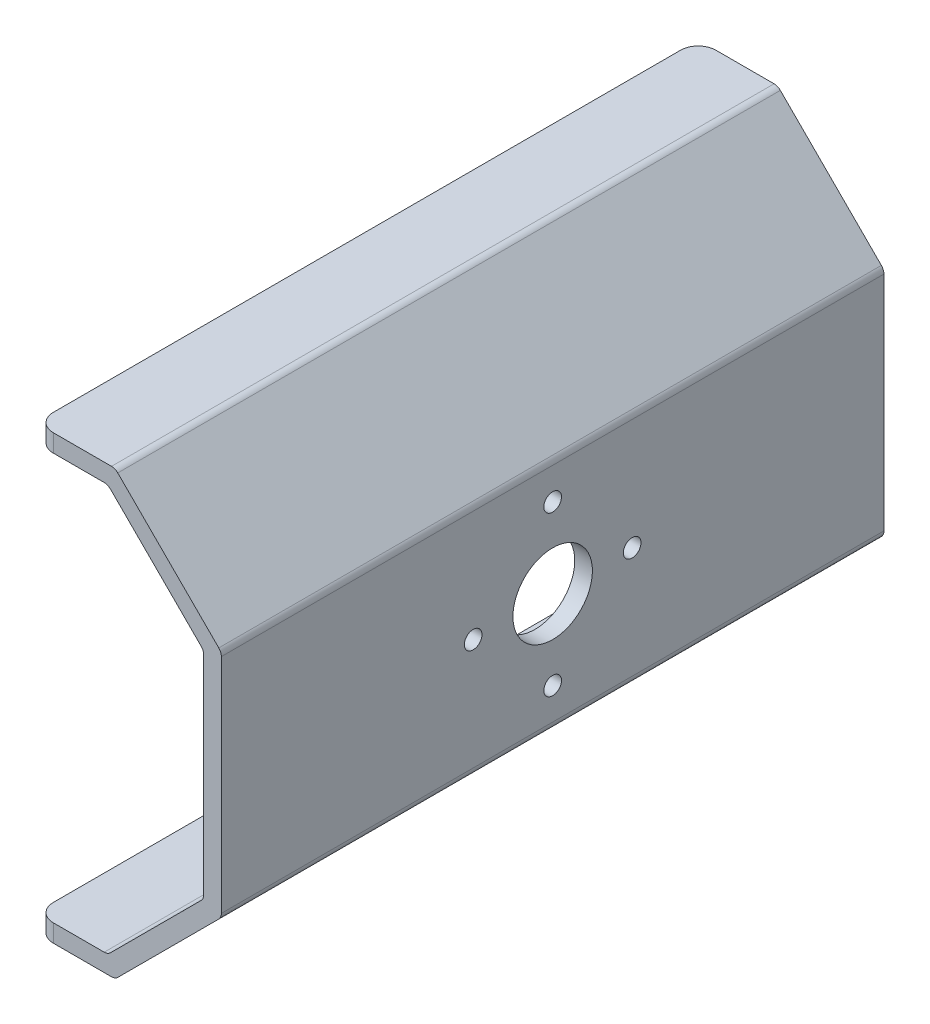
ISO-10303-21;
HEADER;
FILE_DESCRIPTION(('STEP AP214'),'2;1');
FILE_NAME('part.step','',(''),(''),'','','');
FILE_SCHEMA(('AUTOMOTIVE_DESIGN { 1 0 10303 214 1 1 1 1 }'));
ENDSEC;
DATA;
#1=APPLICATION_CONTEXT('core data for automotive mechanical design processes');
#2=APPLICATION_PROTOCOL_DEFINITION('international standard','automotive_design',2000,#1);
#3=PRODUCT_CONTEXT('',#1,'mechanical');
#4=PRODUCT('Part','Part','',(#3));
#5=PRODUCT_RELATED_PRODUCT_CATEGORY('part','',(#4));
#6=PRODUCT_DEFINITION_FORMATION('','',#4);
#7=PRODUCT_DEFINITION_CONTEXT('part definition',#1,'design');
#8=PRODUCT_DEFINITION('design','',#6,#7);
#9=PRODUCT_DEFINITION_SHAPE('','',#8);
#10=(LENGTH_UNIT() NAMED_UNIT(*) SI_UNIT(.MILLI.,.METRE.));
#11=(NAMED_UNIT(*) PLANE_ANGLE_UNIT() SI_UNIT($,.RADIAN.));
#12=(NAMED_UNIT(*) SI_UNIT($,.STERADIAN.) SOLID_ANGLE_UNIT());
#13=UNCERTAINTY_MEASURE_WITH_UNIT(LENGTH_MEASURE(1.E-05),#10,'distance_accuracy_value','');
#14=(GEOMETRIC_REPRESENTATION_CONTEXT(3) GLOBAL_UNCERTAINTY_ASSIGNED_CONTEXT((#13)) GLOBAL_UNIT_ASSIGNED_CONTEXT((#10,
#11,#12)) REPRESENTATION_CONTEXT('',''));
#15=CARTESIAN_POINT('',(0.,0.,0.));
#16=DIRECTION('',(0.,0.,1.));
#17=DIRECTION('',(1.,0.,0.));
#18=AXIS2_PLACEMENT_3D('',#15,#16,#17);
#19=CARTESIAN_POINT('',(0.138164690803216,-19.8750038666925,75.));
#20=DIRECTION('',(0.,0.,-1.));
#21=DIRECTION('',(-1.,0.,0.));
#22=AXIS2_PLACEMENT_3D('',#19,#20,#21);
#23=CYLINDRICAL_SURFACE('',#22,1.);
#24=DIRECTION('',(0.,0.,1.));
#25=VECTOR('',#24,1.);
#26=CARTESIAN_POINT('',(0.845271471989764,-20.5821106478791,75.));
#27=LINE('',#26,#25);
#28=CARTESIAN_POINT('',(0.84527147198976,-20.5821106478791,0.));
#29=VERTEX_POINT('',#28);
#30=CARTESIAN_POINT('',(0.84527147198976,-20.5821106478791,75.));
#31=VERTEX_POINT('',#30);
#32=EDGE_CURVE('E336',#29,#31,#27,.T.);
#33=ORIENTED_EDGE('',*,*,#32,.F.);
#34=CARTESIAN_POINT('',(0.138164690803216,-19.8750038666925,0.));
#35=DIRECTION('',(0.,0.,1.));
#36=DIRECTION('',(1.,0.,0.));
#37=AXIS2_PLACEMENT_3D('',#34,#35,#36);
#38=CIRCLE('',#37,1.);
#39=CARTESIAN_POINT('',(0.138164690803219,-20.8750038666925,0.));
#40=VERTEX_POINT('',#39);
#41=EDGE_CURVE('E46',#29,#40,#38,.F.);
#42=ORIENTED_EDGE('',*,*,#41,.T.);
#43=DIRECTION('',(0.,0.,1.));
#44=VECTOR('',#43,1.);
#45=CARTESIAN_POINT('',(0.138164690803216,-20.8750038666925,75.));
#46=LINE('',#45,#44);
#47=CARTESIAN_POINT('',(0.138164690803219,-20.8750038666925,75.));
#48=VERTEX_POINT('',#47);
#49=EDGE_CURVE('E339',#48,#40,#46,.F.);
#50=ORIENTED_EDGE('',*,*,#49,.F.);
#51=CARTESIAN_POINT('',(0.138164690803216,-19.8750038666925,75.));
#52=DIRECTION('',(0.,0.,1.));
#53=DIRECTION('',(1.,0.,0.));
#54=AXIS2_PLACEMENT_3D('',#51,#52,#53);
#55=CIRCLE('',#54,1.);
#56=EDGE_CURVE('E11',#48,#31,#55,.T.);
#57=ORIENTED_EDGE('',*,*,#56,.T.);
#58=EDGE_LOOP('',(#33,#42,#50,#57));
#59=FACE_BOUND('',#58,.T.);
#60=ADVANCED_FACE('F39',(#59),#23,.F.);
#61=CARTESIAN_POINT('',(0.138164690803206,24.16662669365,75.));
#62=DIRECTION('',(0.,0.,-1.));
#63=DIRECTION('',(-1.,0.,0.));
#64=AXIS2_PLACEMENT_3D('',#61,#62,#63);
#65=CYLINDRICAL_SURFACE('',#64,1.);
#66=DIRECTION('',(0.,0.,1.));
#67=VECTOR('',#66,1.);
#68=CARTESIAN_POINT('',(0.138164690803206,25.16662669365,75.));
#69=LINE('',#68,#67);
#70=CARTESIAN_POINT('',(0.138164690803206,25.16662669365,0.));
#71=VERTEX_POINT('',#70);
#72=CARTESIAN_POINT('',(0.138164690803206,25.16662669365,75.));
#73=VERTEX_POINT('',#72);
#74=EDGE_CURVE('E326',#71,#73,#69,.T.);
#75=ORIENTED_EDGE('',*,*,#74,.F.);
#76=CARTESIAN_POINT('',(0.138164690803206,24.16662669365,0.));
#77=DIRECTION('',(0.,0.,1.));
#78=DIRECTION('',(1.,0.,0.));
#79=AXIS2_PLACEMENT_3D('',#76,#77,#78);
#80=CIRCLE('',#79,1.);
#81=CARTESIAN_POINT('',(0.845271471989751,24.8737334748366,0.));
#82=VERTEX_POINT('',#81);
#83=EDGE_CURVE('E332',#71,#82,#80,.F.);
#84=ORIENTED_EDGE('',*,*,#83,.T.);
#85=DIRECTION('',(0.,0.,1.));
#86=VECTOR('',#85,1.);
#87=CARTESIAN_POINT('',(0.845271471989752,24.8737334748366,75.));
#88=LINE('',#87,#86);
#89=CARTESIAN_POINT('',(0.845271471989751,24.8737334748366,75.));
#90=VERTEX_POINT('',#89);
#91=EDGE_CURVE('E329',#90,#82,#88,.F.);
#92=ORIENTED_EDGE('',*,*,#91,.F.);
#93=CARTESIAN_POINT('',(0.138164690803206,24.16662669365,75.));
#94=DIRECTION('',(0.,0.,1.));
#95=DIRECTION('',(1.,0.,0.));
#96=AXIS2_PLACEMENT_3D('',#93,#94,#95);
#97=CIRCLE('',#96,1.);
#98=EDGE_CURVE('E334',#90,#73,#97,.T.);
#99=ORIENTED_EDGE('',*,*,#98,.T.);
#100=EDGE_LOOP('',(#75,#84,#92,#99));
#101=FACE_BOUND('',#100,.T.);
#102=ADVANCED_FACE('F414',(#101),#65,.F.);
#103=CARTESIAN_POINT('',(0.966591815549409,-21.8750038666925,75.));
#104=DIRECTION('',(0.,0.,-1.));
#105=DIRECTION('',(-1.,0.,0.));
#106=AXIS2_PLACEMENT_3D('',#103,#104,#105);
#107=CYLINDRICAL_SURFACE('',#106,1.);
#108=DIRECTION('',(0.,0.,-1.));
#109=VECTOR('',#108,1.);
#110=CARTESIAN_POINT('',(1.67369859673596,-22.5821106478791,75.));
#111=LINE('',#110,#109);
#112=CARTESIAN_POINT('',(1.67369859673595,-22.5821106478791,75.));
#113=VERTEX_POINT('',#112);
#114=CARTESIAN_POINT('',(1.67369859673595,-22.5821106478791,0.));
#115=VERTEX_POINT('',#114);
#116=EDGE_CURVE('E316',#113,#115,#111,.T.);
#117=ORIENTED_EDGE('',*,*,#116,.F.);
#118=CARTESIAN_POINT('',(0.966591815549409,-21.8750038666925,75.));
#119=DIRECTION('',(0.,0.,1.));
#120=DIRECTION('',(1.,0.,0.));
#121=AXIS2_PLACEMENT_3D('',#118,#119,#120);
#122=CIRCLE('',#121,1.);
#123=CARTESIAN_POINT('',(0.966591815549408,-22.8750038666925,75.));
#124=VERTEX_POINT('',#123);
#125=EDGE_CURVE('E322',#124,#113,#122,.T.);
#126=ORIENTED_EDGE('',*,*,#125,.F.);
#127=DIRECTION('',(0.,0.,-1.));
#128=VECTOR('',#127,1.);
#129=CARTESIAN_POINT('',(0.966591815549409,-22.8750038666925,75.));
#130=LINE('',#129,#128);
#131=CARTESIAN_POINT('',(0.966591815549408,-22.8750038666925,0.));
#132=VERTEX_POINT('',#131);
#133=EDGE_CURVE('E319',#132,#124,#130,.F.);
#134=ORIENTED_EDGE('',*,*,#133,.F.);
#135=CARTESIAN_POINT('',(0.966591815549409,-21.8750038666925,0.));
#136=DIRECTION('',(0.,0.,1.));
#137=DIRECTION('',(1.,0.,0.));
#138=AXIS2_PLACEMENT_3D('',#135,#136,#137);
#139=CIRCLE('',#138,1.);
#140=EDGE_CURVE('E324',#115,#132,#139,.F.);
#141=ORIENTED_EDGE('',*,*,#140,.F.);
#142=EDGE_LOOP('',(#117,#126,#134,#141));
#143=FACE_BOUND('',#142,.T.);
#144=ADVANCED_FACE('F418',(#143),#107,.T.);
#145=CARTESIAN_POINT('',(0.966591815549393,26.16662669365,75.));
#146=DIRECTION('',(0.,0.,-1.));
#147=DIRECTION('',(-1.,0.,0.));
#148=AXIS2_PLACEMENT_3D('',#145,#146,#147);
#149=CYLINDRICAL_SURFACE('',#148,1.);
#150=DIRECTION('',(0.,0.,-1.));
#151=VECTOR('',#150,1.);
#152=CARTESIAN_POINT('',(0.966591815549393,27.16662669365,75.));
#153=LINE('',#152,#151);
#154=CARTESIAN_POINT('',(0.966591815549391,27.16662669365,75.));
#155=VERTEX_POINT('',#154);
#156=CARTESIAN_POINT('',(0.966591815549391,27.16662669365,0.));
#157=VERTEX_POINT('',#156);
#158=EDGE_CURVE('E306',#155,#157,#153,.T.);
#159=ORIENTED_EDGE('',*,*,#158,.F.);
#160=CARTESIAN_POINT('',(0.966591815549393,26.16662669365,75.));
#161=DIRECTION('',(0.,0.,1.));
#162=DIRECTION('',(1.,0.,0.));
#163=AXIS2_PLACEMENT_3D('',#160,#161,#162);
#164=CIRCLE('',#163,1.);
#165=CARTESIAN_POINT('',(1.67369859673594,26.8737334748366,75.));
#166=VERTEX_POINT('',#165);
#167=EDGE_CURVE('E312',#166,#155,#164,.T.);
#168=ORIENTED_EDGE('',*,*,#167,.F.);
#169=DIRECTION('',(0.,0.,-1.));
#170=VECTOR('',#169,1.);
#171=CARTESIAN_POINT('',(1.67369859673594,26.8737334748366,75.));
#172=LINE('',#171,#170);
#173=CARTESIAN_POINT('',(1.67369859673594,26.8737334748366,0.));
#174=VERTEX_POINT('',#173);
#175=EDGE_CURVE('E309',#174,#166,#172,.F.);
#176=ORIENTED_EDGE('',*,*,#175,.F.);
#177=CARTESIAN_POINT('',(0.966591815549393,26.16662669365,0.));
#178=DIRECTION('',(0.,0.,1.));
#179=DIRECTION('',(1.,0.,0.));
#180=AXIS2_PLACEMENT_3D('',#177,#178,#179);
#181=CIRCLE('',#180,1.);
#182=EDGE_CURVE('E314',#157,#174,#181,.F.);
#183=ORIENTED_EDGE('',*,*,#182,.F.);
#184=EDGE_LOOP('',(#159,#168,#176,#183));
#185=FACE_BOUND('',#184,.T.);
#186=ADVANCED_FACE('F453',(#185),#149,.T.);
#187=CARTESIAN_POINT('',(12.4016206580938,14.7315978511056,75.));
#188=DIRECTION('',(0.,0.,1.));
#189=DIRECTION('',(1.,0.,0.));
#190=AXIS2_PLACEMENT_3D('',#187,#188,#189);
#191=CYLINDRICAL_SURFACE('',#190,1.);
#192=DIRECTION('',(0.,0.,1.));
#193=VECTOR('',#192,1.);
#194=CARTESIAN_POINT('',(13.4016206580938,14.7315978511056,75.));
#195=LINE('',#194,#193);
#196=CARTESIAN_POINT('',(13.4016206580938,14.7315978511056,0.));
#197=VERTEX_POINT('',#196);
#198=CARTESIAN_POINT('',(13.4016206580938,14.7315978511056,75.));
#199=VERTEX_POINT('',#198);
#200=EDGE_CURVE('E295',#197,#199,#195,.T.);
#201=ORIENTED_EDGE('',*,*,#200,.F.);
#202=CARTESIAN_POINT('',(12.4016206580938,14.7315978511056,0.));
#203=DIRECTION('',(0.,0.,1.));
#204=DIRECTION('',(1.,0.,0.));
#205=AXIS2_PLACEMENT_3D('',#202,#203,#204);
#206=CIRCLE('',#205,1.);
#207=CARTESIAN_POINT('',(13.1087274392804,15.4387046322922,0.));
#208=VERTEX_POINT('',#207);
#209=EDGE_CURVE('E301',#208,#197,#206,.F.);
#210=ORIENTED_EDGE('',*,*,#209,.F.);
#211=DIRECTION('',(0.,0.,1.));
#212=VECTOR('',#211,1.);
#213=CARTESIAN_POINT('',(13.1087274392804,15.4387046322922,75.));
#214=LINE('',#213,#212);
#215=CARTESIAN_POINT('',(13.1087274392804,15.4387046322922,75.));
#216=VERTEX_POINT('',#215);
#217=EDGE_CURVE('E298',#216,#208,#214,.F.);
#218=ORIENTED_EDGE('',*,*,#217,.F.);
#219=CARTESIAN_POINT('',(12.4016206580938,14.7315978511056,75.));
#220=DIRECTION('',(0.,0.,1.));
#221=DIRECTION('',(1.,0.,0.));
#222=AXIS2_PLACEMENT_3D('',#219,#220,#221);
#223=CIRCLE('',#222,1.);
#224=EDGE_CURVE('E303',#199,#216,#223,.T.);
#225=ORIENTED_EDGE('',*,*,#224,.F.);
#226=EDGE_LOOP('',(#201,#210,#218,#225));
#227=FACE_BOUND('',#226,.T.);
#228=ADVANCED_FACE('F461',(#227),#191,.T.);
#229=CARTESIAN_POINT('',(12.4016206580938,-10.4399750241482,75.));
#230=DIRECTION('',(0.,0.,1.));
#231=DIRECTION('',(1.,0.,0.));
#232=AXIS2_PLACEMENT_3D('',#229,#230,#231);
#233=CYLINDRICAL_SURFACE('',#232,1.);
#234=DIRECTION('',(0.,0.,1.));
#235=VECTOR('',#234,1.);
#236=CARTESIAN_POINT('',(13.1087274392804,-11.1470818053347,75.));
#237=LINE('',#236,#235);
#238=CARTESIAN_POINT('',(13.1087274392804,-11.1470818053347,0.));
#239=VERTEX_POINT('',#238);
#240=CARTESIAN_POINT('',(13.1087274392804,-11.1470818053347,75.));
#241=VERTEX_POINT('',#240);
#242=EDGE_CURVE('E284',#239,#241,#237,.T.);
#243=ORIENTED_EDGE('',*,*,#242,.F.);
#244=CARTESIAN_POINT('',(12.4016206580938,-10.4399750241482,0.));
#245=DIRECTION('',(0.,0.,1.));
#246=DIRECTION('',(1.,0.,0.));
#247=AXIS2_PLACEMENT_3D('',#244,#245,#246);
#248=CIRCLE('',#247,1.);
#249=CARTESIAN_POINT('',(13.4016206580938,-10.4399750241482,0.));
#250=VERTEX_POINT('',#249);
#251=EDGE_CURVE('E290',#250,#239,#248,.F.);
#252=ORIENTED_EDGE('',*,*,#251,.F.);
#253=DIRECTION('',(0.,0.,1.));
#254=VECTOR('',#253,1.);
#255=CARTESIAN_POINT('',(13.4016206580938,-10.4399750241482,75.));
#256=LINE('',#255,#254);
#257=CARTESIAN_POINT('',(13.4016206580938,-10.4399750241482,75.));
#258=VERTEX_POINT('',#257);
#259=EDGE_CURVE('E287',#258,#250,#256,.F.);
#260=ORIENTED_EDGE('',*,*,#259,.F.);
#261=CARTESIAN_POINT('',(12.4016206580938,-10.4399750241482,75.));
#262=DIRECTION('',(0.,0.,1.));
#263=DIRECTION('',(1.,0.,0.));
#264=AXIS2_PLACEMENT_3D('',#261,#262,#263);
#265=CIRCLE('',#264,1.);
#266=EDGE_CURVE('E292',#241,#258,#265,.T.);
#267=ORIENTED_EDGE('',*,*,#266,.F.);
#268=EDGE_LOOP('',(#243,#252,#260,#267));
#269=FACE_BOUND('',#268,.T.);
#270=ADVANCED_FACE('F476',(#269),#233,.T.);
#271=CARTESIAN_POINT('',(10.4016206580938,-9.61154789940197,75.));
#272=DIRECTION('',(0.,0.,-1.));
#273=DIRECTION('',(-1.,0.,0.));
#274=AXIS2_PLACEMENT_3D('',#271,#272,#273);
#275=CYLINDRICAL_SURFACE('',#274,1.);
#276=DIRECTION('',(0.,0.,1.));
#277=VECTOR('',#276,1.);
#278=CARTESIAN_POINT('',(11.4016206580938,-9.61154789940197,75.));
#279=LINE('',#278,#277);
#280=CARTESIAN_POINT('',(11.4016206580938,-9.61154789940197,0.));
#281=VERTEX_POINT('',#280);
#282=CARTESIAN_POINT('',(11.4016206580938,-9.61154789940197,75.));
#283=VERTEX_POINT('',#282);
#284=EDGE_CURVE('E274',#281,#283,#279,.T.);
#285=ORIENTED_EDGE('',*,*,#284,.F.);
#286=CARTESIAN_POINT('',(10.4016206580938,-9.61154789940197,0.));
#287=DIRECTION('',(0.,0.,1.));
#288=DIRECTION('',(1.,0.,0.));
#289=AXIS2_PLACEMENT_3D('',#286,#287,#288);
#290=CIRCLE('',#289,1.);
#291=CARTESIAN_POINT('',(11.1087274392804,-10.3186546805885,0.));
#292=VERTEX_POINT('',#291);
#293=EDGE_CURVE('E280',#281,#292,#290,.F.);
#294=ORIENTED_EDGE('',*,*,#293,.T.);
#295=DIRECTION('',(0.,0.,1.));
#296=VECTOR('',#295,1.);
#297=CARTESIAN_POINT('',(11.1087274392804,-10.3186546805885,75.));
#298=LINE('',#297,#296);
#299=CARTESIAN_POINT('',(11.1087274392804,-10.3186546805885,75.));
#300=VERTEX_POINT('',#299);
#301=EDGE_CURVE('E277',#300,#292,#298,.F.);
#302=ORIENTED_EDGE('',*,*,#301,.F.);
#303=CARTESIAN_POINT('',(10.4016206580938,-9.61154789940197,75.));
#304=DIRECTION('',(0.,0.,1.));
#305=DIRECTION('',(1.,0.,0.));
#306=AXIS2_PLACEMENT_3D('',#303,#304,#305);
#307=CIRCLE('',#306,1.);
#308=EDGE_CURVE('E282',#300,#283,#307,.T.);
#309=ORIENTED_EDGE('',*,*,#308,.T.);
#310=EDGE_LOOP('',(#285,#294,#302,#309));
#311=FACE_BOUND('',#310,.T.);
#312=ADVANCED_FACE('F428',(#311),#275,.F.);
#313=CARTESIAN_POINT('',(10.4016206580938,13.9031707263595,75.));
#314=DIRECTION('',(0.,0.,-1.));
#315=DIRECTION('',(-1.,0.,0.));
#316=AXIS2_PLACEMENT_3D('',#313,#314,#315);
#317=CYLINDRICAL_SURFACE('',#316,1.);
#318=DIRECTION('',(0.,0.,1.));
#319=VECTOR('',#318,1.);
#320=CARTESIAN_POINT('',(11.1087274392804,14.610277507546,75.));
#321=LINE('',#320,#319);
#322=CARTESIAN_POINT('',(11.1087274392804,14.610277507546,0.));
#323=VERTEX_POINT('',#322);
#324=CARTESIAN_POINT('',(11.1087274392804,14.610277507546,75.));
#325=VERTEX_POINT('',#324);
#326=EDGE_CURVE('E263',#323,#325,#321,.T.);
#327=ORIENTED_EDGE('',*,*,#326,.F.);
#328=CARTESIAN_POINT('',(10.4016206580938,13.9031707263595,0.));
#329=DIRECTION('',(0.,0.,1.));
#330=DIRECTION('',(1.,0.,0.));
#331=AXIS2_PLACEMENT_3D('',#328,#329,#330);
#332=CIRCLE('',#331,1.);
#333=CARTESIAN_POINT('',(11.4016206580938,13.9031707263595,0.));
#334=VERTEX_POINT('',#333);
#335=EDGE_CURVE('E269',#323,#334,#332,.F.);
#336=ORIENTED_EDGE('',*,*,#335,.T.);
#337=DIRECTION('',(0.,0.,1.));
#338=VECTOR('',#337,1.);
#339=CARTESIAN_POINT('',(11.4016206580938,13.9031707263595,75.));
#340=LINE('',#339,#338);
#341=CARTESIAN_POINT('',(11.4016206580938,13.9031707263595,75.));
#342=VERTEX_POINT('',#341);
#343=EDGE_CURVE('E266',#342,#334,#340,.F.);
#344=ORIENTED_EDGE('',*,*,#343,.F.);
#345=CARTESIAN_POINT('',(10.4016206580938,13.9031707263595,75.));
#346=DIRECTION('',(0.,0.,1.));
#347=DIRECTION('',(1.,0.,0.));
#348=AXIS2_PLACEMENT_3D('',#345,#346,#347);
#349=CIRCLE('',#348,1.);
#350=EDGE_CURVE('E271',#342,#325,#349,.T.);
#351=ORIENTED_EDGE('',*,*,#350,.T.);
#352=EDGE_LOOP('',(#327,#336,#344,#351));
#353=FACE_BOUND('',#352,.T.);
#354=ADVANCED_FACE('F436',(#353),#317,.F.);
#355=CARTESIAN_POINT('',(-5.61919462207752,0.,73.));
#356=DIRECTION('',(0.,-1.,0.));
#357=DIRECTION('',(0.,0.,-1.));
#358=AXIS2_PLACEMENT_3D('',#355,#356,#357);
#359=CYLINDRICAL_SURFACE('',#358,2.);
#360=DIRECTION('',(0.,-1.,0.));
#361=VECTOR('',#360,1.);
#362=CARTESIAN_POINT('',(-5.61919462207752,0.,75.));
#363=LINE('',#362,#361);
#364=CARTESIAN_POINT('',(-5.61919462207752,27.16662669365,75.));
#365=VERTEX_POINT('',#364);
#366=CARTESIAN_POINT('',(-5.61919462207752,25.16662669365,75.));
#367=VERTEX_POINT('',#366);
#368=EDGE_CURVE('E255',#365,#367,#363,.T.);
#369=ORIENTED_EDGE('',*,*,#368,.F.);
#370=CARTESIAN_POINT('',(-5.61919462207752,27.16662669365,73.));
#371=DIRECTION('',(0.,1.,0.));
#372=DIRECTION('',(0.,0.,1.));
#373=AXIS2_PLACEMENT_3D('',#370,#371,#372);
#374=CIRCLE('',#373,2.);
#375=CARTESIAN_POINT('',(-7.61919462207752,27.16662669365,73.));
#376=VERTEX_POINT('',#375);
#377=EDGE_CURVE('E260',#376,#365,#374,.T.);
#378=ORIENTED_EDGE('',*,*,#377,.F.);
#379=DIRECTION('',(0.,-1.,0.));
#380=VECTOR('',#379,1.);
#381=CARTESIAN_POINT('',(-7.61919462207752,25.16662669365,73.));
#382=LINE('',#381,#380);
#383=CARTESIAN_POINT('',(-7.61919462207752,25.16662669365,73.));
#384=VERTEX_POINT('',#383);
#385=EDGE_CURVE('E258',#384,#376,#382,.F.);
#386=ORIENTED_EDGE('',*,*,#385,.F.);
#387=CARTESIAN_POINT('',(-5.61919462207752,25.16662669365,73.));
#388=DIRECTION('',(0.,1.,0.));
#389=DIRECTION('',(0.,0.,1.));
#390=AXIS2_PLACEMENT_3D('',#387,#388,#389);
#391=CIRCLE('',#390,2.);
#392=EDGE_CURVE('E203',#367,#384,#391,.F.);
#393=ORIENTED_EDGE('',*,*,#392,.F.);
#394=EDGE_LOOP('',(#369,#378,#386,#393));
#395=FACE_BOUND('',#394,.T.);
#396=ADVANCED_FACE('F516',(#395),#359,.T.);
#397=CARTESIAN_POINT('',(-5.6191946220775,0.,73.));
#398=DIRECTION('',(0.,-1.,0.));
#399=DIRECTION('',(0.,0.,-1.));
#400=AXIS2_PLACEMENT_3D('',#397,#398,#399);
#401=CYLINDRICAL_SURFACE('',#400,2.);
#402=DIRECTION('',(0.,-1.,0.));
#403=VECTOR('',#402,1.);
#404=CARTESIAN_POINT('',(-5.6191946220775,0.,75.));
#405=LINE('',#404,#403);
#406=CARTESIAN_POINT('',(-5.6191946220775,-20.8750038666925,75.));
#407=VERTEX_POINT('',#406);
#408=CARTESIAN_POINT('',(-5.6191946220775,-22.8750038666925,75.));
#409=VERTEX_POINT('',#408);
#410=EDGE_CURVE('E244',#407,#409,#405,.T.);
#411=ORIENTED_EDGE('',*,*,#410,.F.);
#412=CARTESIAN_POINT('',(-5.6191946220775,-20.8750038666925,73.));
#413=DIRECTION('',(0.,-1.,0.));
#414=DIRECTION('',(0.,0.,-1.));
#415=AXIS2_PLACEMENT_3D('',#412,#413,#414);
#416=CIRCLE('',#415,2.);
#417=CARTESIAN_POINT('',(-7.6191946220775,-20.8750038666925,73.));
#418=VERTEX_POINT('',#417);
#419=EDGE_CURVE('E250',#418,#407,#416,.F.);
#420=ORIENTED_EDGE('',*,*,#419,.F.);
#421=DIRECTION('',(0.,-1.,0.));
#422=VECTOR('',#421,1.);
#423=CARTESIAN_POINT('',(-7.6191946220775,-22.8750038666925,73.));
#424=LINE('',#423,#422);
#425=CARTESIAN_POINT('',(-7.6191946220775,-22.8750038666925,73.));
#426=VERTEX_POINT('',#425);
#427=EDGE_CURVE('E247',#426,#418,#424,.F.);
#428=ORIENTED_EDGE('',*,*,#427,.F.);
#429=CARTESIAN_POINT('',(-5.6191946220775,-22.8750038666925,73.));
#430=DIRECTION('',(0.,-1.,0.));
#431=DIRECTION('',(0.,0.,-1.));
#432=AXIS2_PLACEMENT_3D('',#429,#430,#431);
#433=CIRCLE('',#432,2.);
#434=EDGE_CURVE('E253',#409,#426,#433,.T.);
#435=ORIENTED_EDGE('',*,*,#434,.F.);
#436=EDGE_LOOP('',(#411,#420,#428,#435));
#437=FACE_BOUND('',#436,.T.);
#438=ADVANCED_FACE('F501',(#437),#401,.T.);
#439=CARTESIAN_POINT('',(-5.6191946220775,-22.8750038666925,2.));
#440=DIRECTION('',(0.,1.,0.));
#441=DIRECTION('',(0.,0.,1.));
#442=AXIS2_PLACEMENT_3D('',#439,#440,#441);
#443=CYLINDRICAL_SURFACE('',#442,2.);
#444=DIRECTION('',(0.,-1.,0.));
#445=VECTOR('',#444,1.);
#446=CARTESIAN_POINT('',(-7.6191946220775,-22.8750038666925,2.));
#447=LINE('',#446,#445);
#448=CARTESIAN_POINT('',(-7.6191946220775,-20.8750038666925,1.99999999999999));
#449=VERTEX_POINT('',#448);
#450=CARTESIAN_POINT('',(-7.6191946220775,-22.8750038666925,1.99999999999999));
#451=VERTEX_POINT('',#450);
#452=EDGE_CURVE('E232',#449,#451,#447,.T.);
#453=ORIENTED_EDGE('',*,*,#452,.F.);
#454=CARTESIAN_POINT('',(-5.6191946220775,-20.8750038666925,2.));
#455=DIRECTION('',(0.,-1.,0.));
#456=DIRECTION('',(0.,0.,-1.));
#457=AXIS2_PLACEMENT_3D('',#454,#455,#456);
#458=CIRCLE('',#457,2.);
#459=CARTESIAN_POINT('',(-5.6191946220775,-20.8750038666925,0.));
#460=VERTEX_POINT('',#459);
#461=EDGE_CURVE('E238',#460,#449,#458,.F.);
#462=ORIENTED_EDGE('',*,*,#461,.F.);
#463=DIRECTION('',(0.,-1.,0.));
#464=VECTOR('',#463,1.);
#465=CARTESIAN_POINT('',(-5.6191946220775,-22.8750038666925,0.));
#466=LINE('',#465,#464);
#467=CARTESIAN_POINT('',(-5.6191946220775,-22.8750038666925,0.));
#468=VERTEX_POINT('',#467);
#469=EDGE_CURVE('E235',#468,#460,#466,.F.);
#470=ORIENTED_EDGE('',*,*,#469,.F.);
#471=CARTESIAN_POINT('',(-5.6191946220775,-22.8750038666925,2.));
#472=DIRECTION('',(0.,-1.,0.));
#473=DIRECTION('',(0.,0.,-1.));
#474=AXIS2_PLACEMENT_3D('',#471,#472,#473);
#475=CIRCLE('',#474,2.);
#476=EDGE_CURVE('E241',#451,#468,#475,.T.);
#477=ORIENTED_EDGE('',*,*,#476,.F.);
#478=EDGE_LOOP('',(#453,#462,#470,#477));
#479=FACE_BOUND('',#478,.T.);
#480=ADVANCED_FACE('F493',(#479),#443,.T.);
#481=CARTESIAN_POINT('',(-5.61919462207752,25.16662669365,2.));
#482=DIRECTION('',(0.,1.,0.));
#483=DIRECTION('',(0.,0.,1.));
#484=AXIS2_PLACEMENT_3D('',#481,#482,#483);
#485=CYLINDRICAL_SURFACE('',#484,2.);
#486=DIRECTION('',(0.,-1.,0.));
#487=VECTOR('',#486,1.);
#488=CARTESIAN_POINT('',(-7.61919462207752,25.16662669365,2.));
#489=LINE('',#488,#487);
#490=CARTESIAN_POINT('',(-7.61919462207752,27.16662669365,1.99999999999999));
#491=VERTEX_POINT('',#490);
#492=CARTESIAN_POINT('',(-7.61919462207752,25.16662669365,1.99999999999999));
#493=VERTEX_POINT('',#492);
#494=EDGE_CURVE('E214',#491,#493,#489,.T.);
#495=ORIENTED_EDGE('',*,*,#494,.F.);
#496=CARTESIAN_POINT('',(-5.61919462207752,27.16662669365,2.));
#497=DIRECTION('',(0.,1.,0.));
#498=DIRECTION('',(0.,0.,1.));
#499=AXIS2_PLACEMENT_3D('',#496,#497,#498);
#500=CIRCLE('',#499,2.);
#501=CARTESIAN_POINT('',(-5.61919462207752,27.16662669365,0.));
#502=VERTEX_POINT('',#501);
#503=EDGE_CURVE('E230',#502,#491,#500,.T.);
#504=ORIENTED_EDGE('',*,*,#503,.F.);
#505=DIRECTION('',(0.,-1.,0.));
#506=VECTOR('',#505,1.);
#507=CARTESIAN_POINT('',(-5.61919462207752,25.16662669365,0.));
#508=LINE('',#507,#506);
#509=CARTESIAN_POINT('',(-5.61919462207752,25.16662669365,0.));
#510=VERTEX_POINT('',#509);
#511=EDGE_CURVE('E216',#510,#502,#508,.F.);
#512=ORIENTED_EDGE('',*,*,#511,.F.);
#513=CARTESIAN_POINT('',(-5.61919462207752,25.16662669365,2.));
#514=DIRECTION('',(0.,1.,0.));
#515=DIRECTION('',(0.,0.,1.));
#516=AXIS2_PLACEMENT_3D('',#513,#514,#515);
#517=CIRCLE('',#516,2.);
#518=EDGE_CURVE('E200',#493,#510,#517,.F.);
#519=ORIENTED_EDGE('',*,*,#518,.F.);
#520=EDGE_LOOP('',(#495,#504,#512,#519));
#521=FACE_BOUND('',#520,.T.);
#522=ADVANCED_FACE('F213',(#521),#485,.T.);
#523=CARTESIAN_POINT('',(1.3808053779225,-20.8750038666925,75.));
#524=DIRECTION('',(0.,-1.,0.));
#525=DIRECTION('',(0.,0.,-1.));
#526=AXIS2_PLACEMENT_3D('',#523,#524,#525);
#527=PLANE('',#526);
#528=DIRECTION('',(1.,0.,0.));
#529=VECTOR('',#528,1.);
#530=CARTESIAN_POINT('',(1.3808053779225,-20.8750038666925,75.));
#531=LINE('',#530,#529);
#532=EDGE_CURVE('E346',#48,#407,#531,.F.);
#533=ORIENTED_EDGE('',*,*,#532,.F.);
#534=ORIENTED_EDGE('',*,*,#49,.T.);
#535=DIRECTION('',(1.,0.,0.));
#536=VECTOR('',#535,1.);
#537=CARTESIAN_POINT('',(1.3808053779225,-20.8750038666925,0.));
#538=LINE('',#537,#536);
#539=EDGE_CURVE('E344',#40,#460,#538,.F.);
#540=ORIENTED_EDGE('',*,*,#539,.T.);
#541=ORIENTED_EDGE('',*,*,#461,.T.);
#542=DIRECTION('',(0.,0.,-1.));
#543=VECTOR('',#542,1.);
#544=CARTESIAN_POINT('',(-7.6191946220775,-20.8750038666925,75.));
#545=LINE('',#544,#543);
#546=EDGE_CURVE('E221',#418,#449,#545,.T.);
#547=ORIENTED_EDGE('',*,*,#546,.F.);
#548=ORIENTED_EDGE('',*,*,#419,.T.);
#549=EDGE_LOOP('',(#533,#534,#540,#541,#547,#548));
#550=FACE_BOUND('',#549,.T.);
#551=ADVANCED_FACE('F343',(#550),#527,.F.);
#552=CARTESIAN_POINT('',(-7.6191946220775,-22.8750038666925,75.));
#553=DIRECTION('',(-1.,0.,0.));
#554=DIRECTION('',(0.,0.,1.));
#555=AXIS2_PLACEMENT_3D('',#552,#553,#554);
#556=PLANE('',#555);
#557=DIRECTION('',(0.,0.,-1.));
#558=VECTOR('',#557,1.);
#559=CARTESIAN_POINT('',(-7.6191946220775,-22.8750038666925,75.));
#560=LINE('',#559,#558);
#561=EDGE_CURVE('E223',#426,#451,#560,.T.);
#562=ORIENTED_EDGE('',*,*,#561,.F.);
#563=ORIENTED_EDGE('',*,*,#427,.T.);
#564=ORIENTED_EDGE('',*,*,#546,.T.);
#565=ORIENTED_EDGE('',*,*,#452,.T.);
#566=EDGE_LOOP('',(#562,#563,#564,#565));
#567=FACE_BOUND('',#566,.T.);
#568=ADVANCED_FACE('F497',(#567),#556,.T.);
#569=CARTESIAN_POINT('',(1.3808053779225,-22.8750038666925,75.));
#570=DIRECTION('',(0.,-1.,0.));
#571=DIRECTION('',(0.,0.,-1.));
#572=AXIS2_PLACEMENT_3D('',#569,#570,#571);
#573=PLANE('',#572);
#574=DIRECTION('',(-1.,0.,0.));
#575=VECTOR('',#574,1.);
#576=CARTESIAN_POINT('',(1.3808053779225,-22.8750038666925,0.));
#577=LINE('',#576,#575);
#578=EDGE_CURVE('E352',#132,#468,#577,.T.);
#579=ORIENTED_EDGE('',*,*,#578,.F.);
#580=ORIENTED_EDGE('',*,*,#133,.T.);
#581=DIRECTION('',(-1.,0.,0.));
#582=VECTOR('',#581,1.);
#583=CARTESIAN_POINT('',(1.3808053779225,-22.8750038666925,75.));
#584=LINE('',#583,#582);
#585=EDGE_CURVE('E502',#124,#409,#584,.T.);
#586=ORIENTED_EDGE('',*,*,#585,.T.);
#587=ORIENTED_EDGE('',*,*,#434,.T.);
#588=ORIENTED_EDGE('',*,*,#561,.T.);
#589=ORIENTED_EDGE('',*,*,#476,.T.);
#590=EDGE_LOOP('',(#579,#580,#586,#587,#588,#589));
#591=FACE_BOUND('',#590,.T.);
#592=ADVANCED_FACE('F488',(#591),#573,.T.);
#593=CARTESIAN_POINT('',(13.4016206580938,-10.8541885865213,75.));
#594=DIRECTION('',(0.707106781186547,-0.707106781186548,0.));
#595=DIRECTION('',(0.707106781186548,0.707106781186547,0.));
#596=AXIS2_PLACEMENT_3D('',#593,#594,#595);
#597=PLANE('',#596);
#598=DIRECTION('',(-0.707106781186549,-0.707106781186547,0.));
#599=VECTOR('',#598,1.);
#600=CARTESIAN_POINT('',(13.4016206580938,-10.8541885865213,75.));
#601=LINE('',#600,#599);
#602=EDGE_CURVE('E504',#241,#113,#601,.T.);
#603=ORIENTED_EDGE('',*,*,#602,.T.);
#604=ORIENTED_EDGE('',*,*,#116,.T.);
#605=DIRECTION('',(-0.707106781186549,-0.707106781186547,0.));
#606=VECTOR('',#605,1.);
#607=CARTESIAN_POINT('',(13.4016206580938,-10.8541885865213,0.));
#608=LINE('',#607,#606);
#609=EDGE_CURVE('E354',#239,#115,#608,.T.);
#610=ORIENTED_EDGE('',*,*,#609,.F.);
#611=ORIENTED_EDGE('',*,*,#242,.T.);
#612=EDGE_LOOP('',(#603,#604,#610,#611));
#613=FACE_BOUND('',#612,.T.);
#614=ADVANCED_FACE('F481',(#613),#597,.T.);
#615=CARTESIAN_POINT('',(13.4016206580938,15.1458114134787,75.));
#616=DIRECTION('',(1.,0.,0.));
#617=DIRECTION('',(0.,1.,0.));
#618=AXIS2_PLACEMENT_3D('',#615,#616,#617);
#619=PLANE('',#618);
#620=CARTESIAN_POINT('',(13.4016206580938,2.14581141347874,46.5));
#621=DIRECTION('',(1.,0.,0.));
#622=DIRECTION('',(0.,1.,0.));
#623=AXIS2_PLACEMENT_3D('',#620,#621,#622);
#624=CIRCLE('',#623,0.999999999999998);
#625=CARTESIAN_POINT('',(13.4016206580938,3.14581141347874,46.5));
#626=VERTEX_POINT('',#625);
#627=EDGE_CURVE('E738',#626,#626,#624,.T.);
#628=ORIENTED_EDGE('',*,*,#627,.F.);
#629=EDGE_LOOP('',(#628));
#630=FACE_BOUND('',#629,.T.);
#631=CARTESIAN_POINT('',(13.4016206580938,2.14581141347875,28.5));
#632=DIRECTION('',(1.,0.,0.));
#633=DIRECTION('',(0.,-1.,0.));
#634=AXIS2_PLACEMENT_3D('',#631,#632,#633);
#635=CIRCLE('',#634,0.999999999999998);
#636=CARTESIAN_POINT('',(13.4016206580938,1.14581141347875,28.5));
#637=VERTEX_POINT('',#636);
#638=EDGE_CURVE('E741',#637,#637,#635,.T.);
#639=ORIENTED_EDGE('',*,*,#638,.F.);
#640=EDGE_LOOP('',(#639));
#641=FACE_BOUND('',#640,.T.);
#642=CARTESIAN_POINT('',(13.4016206580938,11.1458114134787,37.5));
#643=DIRECTION('',(1.,0.,0.));
#644=DIRECTION('',(0.,1.,0.));
#645=AXIS2_PLACEMENT_3D('',#642,#643,#644);
#646=CIRCLE('',#645,0.999999999999998);
#647=CARTESIAN_POINT('',(13.4016206580938,12.1458114134787,37.5));
#648=VERTEX_POINT('',#647);
#649=EDGE_CURVE('E745',#648,#648,#646,.T.);
#650=ORIENTED_EDGE('',*,*,#649,.F.);
#651=EDGE_LOOP('',(#650));
#652=FACE_BOUND('',#651,.T.);
#653=CARTESIAN_POINT('',(13.4016206580938,-6.85418858652125,37.5));
#654=DIRECTION('',(1.,0.,0.));
#655=DIRECTION('',(0.,-1.,0.));
#656=AXIS2_PLACEMENT_3D('',#653,#654,#655);
#657=CIRCLE('',#656,0.999999999999998);
#658=CARTESIAN_POINT('',(13.4016206580938,-7.85418858652125,37.5));
#659=VERTEX_POINT('',#658);
#660=EDGE_CURVE('E749',#659,#659,#657,.T.);
#661=ORIENTED_EDGE('',*,*,#660,.F.);
#662=EDGE_LOOP('',(#661));
#663=FACE_BOUND('',#662,.T.);
#664=CARTESIAN_POINT('',(13.4016206580938,2.14581141347875,37.5));
#665=DIRECTION('',(1.,0.,0.));
#666=DIRECTION('',(0.,1.,0.));
#667=AXIS2_PLACEMENT_3D('',#664,#665,#666);
#668=CIRCLE('',#667,4.5);
#669=CARTESIAN_POINT('',(13.4016206580938,6.64581141347874,37.5));
#670=VERTEX_POINT('',#669);
#671=EDGE_CURVE('E385',#670,#670,#668,.T.);
#672=ORIENTED_EDGE('',*,*,#671,.F.);
#673=EDGE_LOOP('',(#672));
#674=FACE_BOUND('',#673,.T.);
#675=DIRECTION('',(0.,-1.,0.));
#676=VECTOR('',#675,1.);
#677=CARTESIAN_POINT('',(13.4016206580938,15.1458114134787,0.));
#678=LINE('',#677,#676);
#679=EDGE_CURVE('E362',#197,#250,#678,.T.);
#680=ORIENTED_EDGE('',*,*,#679,.F.);
#681=ORIENTED_EDGE('',*,*,#200,.T.);
#682=DIRECTION('',(0.,-1.,0.));
#683=VECTOR('',#682,1.);
#684=CARTESIAN_POINT('',(13.4016206580938,15.1458114134787,75.));
#685=LINE('',#684,#683);
#686=EDGE_CURVE('E466',#199,#258,#685,.T.);
#687=ORIENTED_EDGE('',*,*,#686,.T.);
#688=ORIENTED_EDGE('',*,*,#259,.T.);
#689=EDGE_LOOP('',(#680,#681,#687,#688));
#690=FACE_BOUND('',#689,.T.);
#691=ADVANCED_FACE('F471',(#630,#641,#652,#663,#674,#690),#619,.T.);
#692=CARTESIAN_POINT('',(1.38080537792248,27.16662669365,75.));
#693=DIRECTION('',(0.707106781186546,0.707106781186549,0.));
#694=DIRECTION('',(-0.707106781186549,0.707106781186546,0.));
#695=AXIS2_PLACEMENT_3D('',#692,#693,#694);
#696=PLANE('',#695);
#697=DIRECTION('',(0.707106781186549,-0.707106781186546,0.));
#698=VECTOR('',#697,1.);
#699=CARTESIAN_POINT('',(1.38080537792248,27.16662669365,0.));
#700=LINE('',#699,#698);
#701=EDGE_CURVE('E364',#174,#208,#700,.T.);
#702=ORIENTED_EDGE('',*,*,#701,.F.);
#703=ORIENTED_EDGE('',*,*,#175,.T.);
#704=DIRECTION('',(0.707106781186549,-0.707106781186546,0.));
#705=VECTOR('',#704,1.);
#706=CARTESIAN_POINT('',(1.38080537792248,27.16662669365,75.));
#707=LINE('',#706,#705);
#708=EDGE_CURVE('E465',#166,#216,#707,.T.);
#709=ORIENTED_EDGE('',*,*,#708,.T.);
#710=ORIENTED_EDGE('',*,*,#217,.T.);
#711=EDGE_LOOP('',(#702,#703,#709,#710));
#712=FACE_BOUND('',#711,.T.);
#713=ADVANCED_FACE('F463',(#712),#696,.T.);
#714=CARTESIAN_POINT('',(-7.61919462207752,27.16662669365,75.));
#715=DIRECTION('',(0.,1.,0.));
#716=DIRECTION('',(0.,0.,1.));
#717=AXIS2_PLACEMENT_3D('',#714,#715,#716);
#718=PLANE('',#717);
#719=DIRECTION('',(1.,0.,0.));
#720=VECTOR('',#719,1.);
#721=CARTESIAN_POINT('',(-7.61919462207752,27.16662669365,75.));
#722=LINE('',#721,#720);
#723=EDGE_CURVE('E451',#365,#155,#722,.T.);
#724=ORIENTED_EDGE('',*,*,#723,.T.);
#725=ORIENTED_EDGE('',*,*,#158,.T.);
#726=DIRECTION('',(1.,0.,0.));
#727=VECTOR('',#726,1.);
#728=CARTESIAN_POINT('',(-7.61919462207752,27.16662669365,0.));
#729=LINE('',#728,#727);
#730=EDGE_CURVE('E366',#502,#157,#729,.T.);
#731=ORIENTED_EDGE('',*,*,#730,.F.);
#732=ORIENTED_EDGE('',*,*,#503,.T.);
#733=DIRECTION('',(0.,0.,-1.));
#734=VECTOR('',#733,1.);
#735=CARTESIAN_POINT('',(-7.61919462207752,27.16662669365,75.));
#736=LINE('',#735,#734);
#737=EDGE_CURVE('E208',#376,#491,#736,.T.);
#738=ORIENTED_EDGE('',*,*,#737,.F.);
#739=ORIENTED_EDGE('',*,*,#377,.T.);
#740=EDGE_LOOP('',(#724,#725,#731,#732,#738,#739));
#741=FACE_BOUND('',#740,.T.);
#742=ADVANCED_FACE('F448',(#741),#718,.T.);
#743=CARTESIAN_POINT('',(-7.61919462207752,25.16662669365,75.));
#744=DIRECTION('',(-1.,0.,0.));
#745=DIRECTION('',(0.,0.,1.));
#746=AXIS2_PLACEMENT_3D('',#743,#744,#745);
#747=PLANE('',#746);
#748=DIRECTION('',(0.,0.,-1.));
#749=VECTOR('',#748,1.);
#750=CARTESIAN_POINT('',(-7.61919462207752,25.16662669365,75.));
#751=LINE('',#750,#749);
#752=EDGE_CURVE('E196',#384,#493,#751,.T.);
#753=ORIENTED_EDGE('',*,*,#752,.F.);
#754=ORIENTED_EDGE('',*,*,#385,.T.);
#755=ORIENTED_EDGE('',*,*,#737,.T.);
#756=ORIENTED_EDGE('',*,*,#494,.T.);
#757=EDGE_LOOP('',(#753,#754,#755,#756));
#758=FACE_BOUND('',#757,.T.);
#759=ADVANCED_FACE('F218',(#758),#747,.T.);
#760=CARTESIAN_POINT('',(-7.61919462207752,25.16662669365,75.));
#761=DIRECTION('',(0.,1.,0.));
#762=DIRECTION('',(0.,0.,1.));
#763=AXIS2_PLACEMENT_3D('',#760,#761,#762);
#764=PLANE('',#763);
#765=DIRECTION('',(1.,0.,0.));
#766=VECTOR('',#765,1.);
#767=CARTESIAN_POINT('',(-7.61919462207752,25.16662669365,0.));
#768=LINE('',#767,#766);
#769=EDGE_CURVE('E369',#510,#71,#768,.T.);
#770=ORIENTED_EDGE('',*,*,#769,.T.);
#771=ORIENTED_EDGE('',*,*,#74,.T.);
#772=DIRECTION('',(1.,0.,0.));
#773=VECTOR('',#772,1.);
#774=CARTESIAN_POINT('',(-7.61919462207752,25.16662669365,75.));
#775=LINE('',#774,#773);
#776=EDGE_CURVE('E512',#367,#73,#775,.T.);
#777=ORIENTED_EDGE('',*,*,#776,.F.);
#778=ORIENTED_EDGE('',*,*,#392,.T.);
#779=ORIENTED_EDGE('',*,*,#752,.T.);
#780=ORIENTED_EDGE('',*,*,#518,.T.);
#781=EDGE_LOOP('',(#770,#771,#777,#778,#779,#780));
#782=FACE_BOUND('',#781,.T.);
#783=ADVANCED_FACE('F199',(#782),#764,.F.);
#784=CARTESIAN_POINT('',(-0.0334081844506077,25.7524131312769,75.));
#785=DIRECTION('',(0.707106781186546,0.707106781186549,0.));
#786=DIRECTION('',(-0.707106781186549,0.707106781186546,0.));
#787=AXIS2_PLACEMENT_3D('',#784,#785,#786);
#788=PLANE('',#787);
#789=DIRECTION('',(0.707106781186549,-0.707106781186546,0.));
#790=VECTOR('',#789,1.);
#791=CARTESIAN_POINT('',(-0.0334081844506077,25.7524131312769,75.));
#792=LINE('',#791,#790);
#793=EDGE_CURVE('E443',#90,#325,#792,.T.);
#794=ORIENTED_EDGE('',*,*,#793,.F.);
#795=ORIENTED_EDGE('',*,*,#91,.T.);
#796=DIRECTION('',(0.707106781186549,-0.707106781186546,0.));
#797=VECTOR('',#796,1.);
#798=CARTESIAN_POINT('',(-0.0334081844506077,25.7524131312769,0.));
#799=LINE('',#798,#797);
#800=EDGE_CURVE('E371',#82,#323,#799,.T.);
#801=ORIENTED_EDGE('',*,*,#800,.T.);
#802=ORIENTED_EDGE('',*,*,#326,.T.);
#803=EDGE_LOOP('',(#794,#795,#801,#802));
#804=FACE_BOUND('',#803,.T.);
#805=ADVANCED_FACE('F441',(#804),#788,.F.);
#806=CARTESIAN_POINT('',(11.4016206580938,15.1458114134787,75.));
#807=DIRECTION('',(1.,0.,0.));
#808=DIRECTION('',(0.,1.,0.));
#809=AXIS2_PLACEMENT_3D('',#806,#807,#808);
#810=PLANE('',#809);
#811=CARTESIAN_POINT('',(11.4016206580938,2.14581141347874,46.5));
#812=DIRECTION('',(1.,0.,0.));
#813=DIRECTION('',(0.,1.,0.));
#814=AXIS2_PLACEMENT_3D('',#811,#812,#813);
#815=CIRCLE('',#814,0.999999999999998);
#816=CARTESIAN_POINT('',(11.4016206580938,3.14581141347874,46.5));
#817=VERTEX_POINT('',#816);
#818=EDGE_CURVE('E226',#817,#817,#815,.T.);
#819=ORIENTED_EDGE('',*,*,#818,.T.);
#820=EDGE_LOOP('',(#819));
#821=FACE_BOUND('',#820,.T.);
#822=CARTESIAN_POINT('',(11.4016206580938,2.14581141347875,28.5));
#823=DIRECTION('',(1.,0.,0.));
#824=DIRECTION('',(0.,1.,0.));
#825=AXIS2_PLACEMENT_3D('',#822,#823,#824);
#826=CIRCLE('',#825,0.999999999999998);
#827=CARTESIAN_POINT('',(11.4016206580938,3.14581141347875,28.5));
#828=VERTEX_POINT('',#827);
#829=EDGE_CURVE('E357',#828,#828,#826,.T.);
#830=ORIENTED_EDGE('',*,*,#829,.T.);
#831=EDGE_LOOP('',(#830));
#832=FACE_BOUND('',#831,.T.);
#833=CARTESIAN_POINT('',(11.4016206580938,11.1458114134787,37.5));
#834=DIRECTION('',(1.,0.,0.));
#835=DIRECTION('',(0.,1.,0.));
#836=AXIS2_PLACEMENT_3D('',#833,#834,#835);
#837=CIRCLE('',#836,0.999999999999998);
#838=CARTESIAN_POINT('',(11.4016206580938,12.1458114134787,37.5));
#839=VERTEX_POINT('',#838);
#840=EDGE_CURVE('E388',#839,#839,#837,.T.);
#841=ORIENTED_EDGE('',*,*,#840,.T.);
#842=EDGE_LOOP('',(#841));
#843=FACE_BOUND('',#842,.T.);
#844=CARTESIAN_POINT('',(11.4016206580938,-6.85418858652125,37.5));
#845=DIRECTION('',(1.,0.,0.));
#846=DIRECTION('',(0.,1.,0.));
#847=AXIS2_PLACEMENT_3D('',#844,#845,#846);
#848=CIRCLE('',#847,0.999999999999998);
#849=CARTESIAN_POINT('',(11.4016206580938,-5.85418858652125,37.5));
#850=VERTEX_POINT('',#849);
#851=EDGE_CURVE('E384',#850,#850,#848,.T.);
#852=ORIENTED_EDGE('',*,*,#851,.T.);
#853=EDGE_LOOP('',(#852));
#854=FACE_BOUND('',#853,.T.);
#855=CARTESIAN_POINT('',(11.4016206580938,2.14581141347875,37.5));
#856=DIRECTION('',(1.,0.,0.));
#857=DIRECTION('',(0.,1.,0.));
#858=AXIS2_PLACEMENT_3D('',#855,#856,#857);
#859=CIRCLE('',#858,4.5);
#860=CARTESIAN_POINT('',(11.4016206580938,6.64581141347874,37.5));
#861=VERTEX_POINT('',#860);
#862=EDGE_CURVE('E381',#861,#861,#859,.T.);
#863=ORIENTED_EDGE('',*,*,#862,.T.);
#864=EDGE_LOOP('',(#863));
#865=FACE_BOUND('',#864,.T.);
#866=DIRECTION('',(0.,-1.,0.));
#867=VECTOR('',#866,1.);
#868=CARTESIAN_POINT('',(11.4016206580938,15.1458114134787,0.));
#869=LINE('',#868,#867);
#870=EDGE_CURVE('E373',#334,#281,#869,.T.);
#871=ORIENTED_EDGE('',*,*,#870,.T.);
#872=ORIENTED_EDGE('',*,*,#284,.T.);
#873=DIRECTION('',(0.,-1.,0.));
#874=VECTOR('',#873,1.);
#875=CARTESIAN_POINT('',(11.4016206580938,15.1458114134787,75.));
#876=LINE('',#875,#874);
#877=EDGE_CURVE('E433',#342,#283,#876,.T.);
#878=ORIENTED_EDGE('',*,*,#877,.F.);
#879=ORIENTED_EDGE('',*,*,#343,.T.);
#880=EDGE_LOOP('',(#871,#872,#878,#879));
#881=FACE_BOUND('',#880,.T.);
#882=ADVANCED_FACE('F393',(#821,#832,#843,#854,#865,#881),#810,.F.);
#883=CARTESIAN_POINT('',(11.9874070957207,-9.43997502414816,75.));
#884=DIRECTION('',(0.707106781186547,-0.707106781186548,0.));
#885=DIRECTION('',(0.707106781186548,0.707106781186547,0.));
#886=AXIS2_PLACEMENT_3D('',#883,#884,#885);
#887=PLANE('',#886);
#888=DIRECTION('',(-0.707106781186549,-0.707106781186547,0.));
#889=VECTOR('',#888,1.);
#890=CARTESIAN_POINT('',(11.9874070957207,-9.43997502414816,0.));
#891=LINE('',#890,#889);
#892=EDGE_CURVE('E376',#292,#29,#891,.T.);
#893=ORIENTED_EDGE('',*,*,#892,.T.);
#894=ORIENTED_EDGE('',*,*,#32,.T.);
#895=DIRECTION('',(-0.707106781186549,-0.707106781186547,0.));
#896=VECTOR('',#895,1.);
#897=CARTESIAN_POINT('',(11.9874070957207,-9.43997502414816,75.));
#898=LINE('',#897,#896);
#899=EDGE_CURVE('E209',#300,#31,#898,.T.);
#900=ORIENTED_EDGE('',*,*,#899,.F.);
#901=ORIENTED_EDGE('',*,*,#301,.T.);
#902=EDGE_LOOP('',(#893,#894,#900,#901));
#903=FACE_BOUND('',#902,.T.);
#904=ADVANCED_FACE('F422',(#903),#887,.F.);
#905=CARTESIAN_POINT('',(0.,0.,75.));
#906=DIRECTION('',(0.,0.,1.));
#907=DIRECTION('',(1.,0.,0.));
#908=AXIS2_PLACEMENT_3D('',#905,#906,#907);
#909=PLANE('',#908);
#910=ORIENTED_EDGE('',*,*,#56,.F.);
#911=ORIENTED_EDGE('',*,*,#532,.T.);
#912=ORIENTED_EDGE('',*,*,#410,.T.);
#913=ORIENTED_EDGE('',*,*,#585,.F.);
#914=ORIENTED_EDGE('',*,*,#125,.T.);
#915=ORIENTED_EDGE('',*,*,#602,.F.);
#916=ORIENTED_EDGE('',*,*,#266,.T.);
#917=ORIENTED_EDGE('',*,*,#686,.F.);
#918=ORIENTED_EDGE('',*,*,#224,.T.);
#919=ORIENTED_EDGE('',*,*,#708,.F.);
#920=ORIENTED_EDGE('',*,*,#167,.T.);
#921=ORIENTED_EDGE('',*,*,#723,.F.);
#922=ORIENTED_EDGE('',*,*,#368,.T.);
#923=ORIENTED_EDGE('',*,*,#776,.T.);
#924=ORIENTED_EDGE('',*,*,#98,.F.);
#925=ORIENTED_EDGE('',*,*,#793,.T.);
#926=ORIENTED_EDGE('',*,*,#350,.F.);
#927=ORIENTED_EDGE('',*,*,#877,.T.);
#928=ORIENTED_EDGE('',*,*,#308,.F.);
#929=ORIENTED_EDGE('',*,*,#899,.T.);
#930=EDGE_LOOP('',(#910,#911,#912,#913,#914,#915,#916,#917,#918,#919,#920,#921,#922,#923,#924,
#925,#926,#927,#928,#929));
#931=FACE_BOUND('',#930,.T.);
#932=ADVANCED_FACE('F469',(#931),#909,.T.);
#933=CARTESIAN_POINT('',(0.,0.,0.));
#934=DIRECTION('',(0.,0.,1.));
#935=DIRECTION('',(1.,0.,0.));
#936=AXIS2_PLACEMENT_3D('',#933,#934,#935);
#937=PLANE('',#936);
#938=ORIENTED_EDGE('',*,*,#609,.T.);
#939=ORIENTED_EDGE('',*,*,#140,.T.);
#940=ORIENTED_EDGE('',*,*,#578,.T.);
#941=ORIENTED_EDGE('',*,*,#469,.T.);
#942=ORIENTED_EDGE('',*,*,#539,.F.);
#943=ORIENTED_EDGE('',*,*,#41,.F.);
#944=ORIENTED_EDGE('',*,*,#892,.F.);
#945=ORIENTED_EDGE('',*,*,#293,.F.);
#946=ORIENTED_EDGE('',*,*,#870,.F.);
#947=ORIENTED_EDGE('',*,*,#335,.F.);
#948=ORIENTED_EDGE('',*,*,#800,.F.);
#949=ORIENTED_EDGE('',*,*,#83,.F.);
#950=ORIENTED_EDGE('',*,*,#769,.F.);
#951=ORIENTED_EDGE('',*,*,#511,.T.);
#952=ORIENTED_EDGE('',*,*,#730,.T.);
#953=ORIENTED_EDGE('',*,*,#182,.T.);
#954=ORIENTED_EDGE('',*,*,#701,.T.);
#955=ORIENTED_EDGE('',*,*,#209,.T.);
#956=ORIENTED_EDGE('',*,*,#679,.T.);
#957=ORIENTED_EDGE('',*,*,#251,.T.);
#958=EDGE_LOOP('',(#938,#939,#940,#941,#942,#943,#944,#945,#946,#947,#948,#949,#950,#951,#952,
#953,#954,#955,#956,#957));
#959=FACE_BOUND('',#958,.T.);
#960=ADVANCED_FACE('F349',(#959),#937,.F.);
#961=CARTESIAN_POINT('',(3.40162065809382,2.14581141347875,37.5));
#962=DIRECTION('',(1.,0.,0.));
#963=DIRECTION('',(0.,1.,0.));
#964=AXIS2_PLACEMENT_3D('',#961,#962,#963);
#965=CYLINDRICAL_SURFACE('',#964,4.5);
#966=ORIENTED_EDGE('',*,*,#671,.T.);
#967=EDGE_LOOP('',(#966));
#968=FACE_BOUND('',#967,.T.);
#969=ORIENTED_EDGE('',*,*,#862,.F.);
#970=EDGE_LOOP('',(#969));
#971=FACE_BOUND('',#970,.T.);
#972=ADVANCED_FACE('F639',(#968,#971),#965,.F.);
#973=CARTESIAN_POINT('',(3.40162065809382,-6.85418858652125,37.5));
#974=DIRECTION('',(1.,0.,0.));
#975=DIRECTION('',(0.,1.,0.));
#976=AXIS2_PLACEMENT_3D('',#973,#974,#975);
#977=CYLINDRICAL_SURFACE('',#976,0.999999999999998);
#978=ORIENTED_EDGE('',*,*,#660,.T.);
#979=EDGE_LOOP('',(#978));
#980=FACE_BOUND('',#979,.T.);
#981=ORIENTED_EDGE('',*,*,#851,.F.);
#982=EDGE_LOOP('',(#981));
#983=FACE_BOUND('',#982,.T.);
#984=ADVANCED_FACE('F408',(#980,#983),#977,.F.);
#985=CARTESIAN_POINT('',(3.40162065809382,11.1458114134787,37.5));
#986=DIRECTION('',(1.,0.,0.));
#987=DIRECTION('',(0.,1.,0.));
#988=AXIS2_PLACEMENT_3D('',#985,#986,#987);
#989=CYLINDRICAL_SURFACE('',#988,0.999999999999998);
#990=ORIENTED_EDGE('',*,*,#649,.T.);
#991=EDGE_LOOP('',(#990));
#992=FACE_BOUND('',#991,.T.);
#993=ORIENTED_EDGE('',*,*,#840,.F.);
#994=EDGE_LOOP('',(#993));
#995=FACE_BOUND('',#994,.T.);
#996=ADVANCED_FACE('F399',(#992,#995),#989,.F.);
#997=CARTESIAN_POINT('',(3.40162065809382,2.14581141347875,28.5));
#998=DIRECTION('',(1.,0.,0.));
#999=DIRECTION('',(0.,1.,0.));
#1000=AXIS2_PLACEMENT_3D('',#997,#998,#999);
#1001=CYLINDRICAL_SURFACE('',#1000,0.999999999999998);
#1002=ORIENTED_EDGE('',*,*,#638,.T.);
#1003=EDGE_LOOP('',(#1002));
#1004=FACE_BOUND('',#1003,.T.);
#1005=ORIENTED_EDGE('',*,*,#829,.F.);
#1006=EDGE_LOOP('',(#1005));
#1007=FACE_BOUND('',#1006,.T.);
#1008=ADVANCED_FACE('F396',(#1004,#1007),#1001,.F.);
#1009=CARTESIAN_POINT('',(3.40162065809382,2.14581141347874,46.5));
#1010=DIRECTION('',(1.,0.,0.));
#1011=DIRECTION('',(0.,1.,0.));
#1012=AXIS2_PLACEMENT_3D('',#1009,#1010,#1011);
#1013=CYLINDRICAL_SURFACE('',#1012,0.999999999999998);
#1014=ORIENTED_EDGE('',*,*,#627,.T.);
#1015=EDGE_LOOP('',(#1014));
#1016=FACE_BOUND('',#1015,.T.);
#1017=ORIENTED_EDGE('',*,*,#818,.F.);
#1018=EDGE_LOOP('',(#1017));
#1019=FACE_BOUND('',#1018,.T.);
#1020=ADVANCED_FACE('F398',(#1016,#1019),#1013,.F.);
#1021=CLOSED_SHELL('',(#60,#102,#144,#186,#228,#270,#312,#354,#396,#438,#480,#522,#551,#568,
#592,#614,#691,#713,#742,#759,#783,#805,#882,#904,#932,#960,#972,#984,#996,#1008,#1020));
#1022=MANIFOLD_SOLID_BREP('B2',#1021);
#1023=ADVANCED_BREP_SHAPE_REPRESENTATION('',(#18,#1022),#14);
#1024=SHAPE_DEFINITION_REPRESENTATION(#9,#1023);
ENDSEC;
END-ISO-10303-21;
